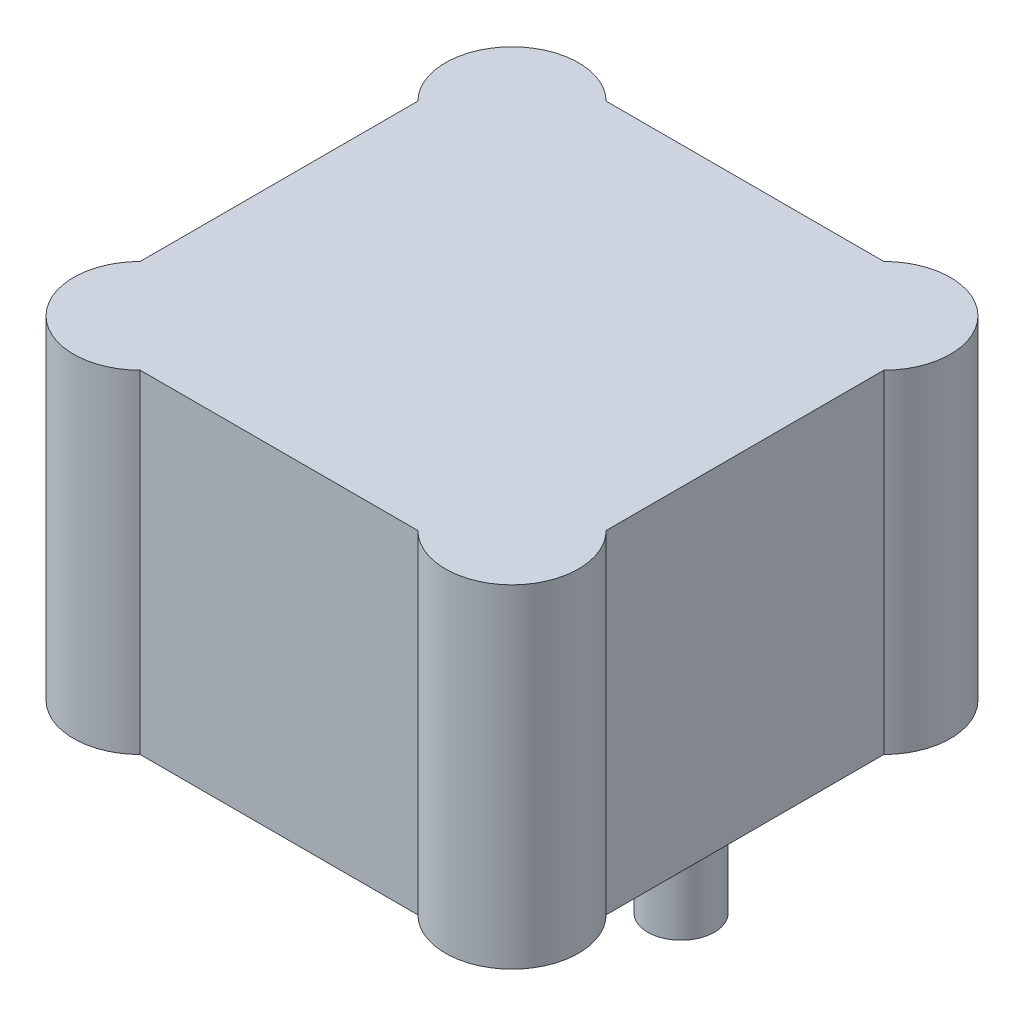
ISO-10303-21;
HEADER;
FILE_DESCRIPTION(('STEP AP214'),'2;1');
FILE_NAME('part.step','',(''),(''),'','','');
FILE_SCHEMA(('AUTOMOTIVE_DESIGN { 1 0 10303 214 1 1 1 1 }'));
ENDSEC;
DATA;
#1=APPLICATION_CONTEXT('core data for automotive mechanical design processes');
#2=APPLICATION_PROTOCOL_DEFINITION('international standard','automotive_design',2000,#1);
#3=PRODUCT_CONTEXT('',#1,'mechanical');
#4=PRODUCT('Part','Part','',(#3));
#5=PRODUCT_RELATED_PRODUCT_CATEGORY('part','',(#4));
#6=PRODUCT_DEFINITION_FORMATION('','',#4);
#7=PRODUCT_DEFINITION_CONTEXT('part definition',#1,'design');
#8=PRODUCT_DEFINITION('design','',#6,#7);
#9=PRODUCT_DEFINITION_SHAPE('','',#8);
#10=(LENGTH_UNIT() NAMED_UNIT(*) SI_UNIT(.MILLI.,.METRE.));
#11=(NAMED_UNIT(*) PLANE_ANGLE_UNIT() SI_UNIT($,.RADIAN.));
#12=(NAMED_UNIT(*) SI_UNIT($,.STERADIAN.) SOLID_ANGLE_UNIT());
#13=UNCERTAINTY_MEASURE_WITH_UNIT(LENGTH_MEASURE(1.E-05),#10,'distance_accuracy_value','');
#14=(GEOMETRIC_REPRESENTATION_CONTEXT(3) GLOBAL_UNCERTAINTY_ASSIGNED_CONTEXT((#13)) GLOBAL_UNIT_ASSIGNED_CONTEXT((#10,
#11,#12)) REPRESENTATION_CONTEXT('',''));
#15=CARTESIAN_POINT('',(0.,0.,0.));
#16=DIRECTION('',(0.,0.,1.));
#17=DIRECTION('',(1.,0.,0.));
#18=AXIS2_PLACEMENT_3D('',#15,#16,#17);
#19=CARTESIAN_POINT('',(-5.58578643762691,10.,-5.58578643762691));
#20=DIRECTION('',(0.,-1.,0.));
#21=DIRECTION('',(0.,0.,-1.));
#22=AXIS2_PLACEMENT_3D('',#19,#20,#21);
#23=CYLINDRICAL_SURFACE('',#22,2.);
#24=CARTESIAN_POINT('',(-5.58578643762691,0.,-5.58578643762691));
#25=DIRECTION('',(0.,1.,0.));
#26=DIRECTION('',(0.,0.,1.));
#27=AXIS2_PLACEMENT_3D('',#24,#25,#26);
#28=CIRCLE('',#27,2.);
#29=CARTESIAN_POINT('',(-4.17157287525381,0.,-7.));
#30=VERTEX_POINT('',#29);
#31=CARTESIAN_POINT('',(-7.,0.,-4.17157287525381));
#32=VERTEX_POINT('',#31);
#33=EDGE_CURVE('E133',#30,#32,#28,.T.);
#34=ORIENTED_EDGE('',*,*,#33,.T.);
#35=DIRECTION('',(0.,-1.,0.));
#36=VECTOR('',#35,1.);
#37=CARTESIAN_POINT('',(-7.,10.,-4.17157287525381));
#38=LINE('',#37,#36);
#39=CARTESIAN_POINT('',(-7.,10.,-4.17157287525381));
#40=VERTEX_POINT('',#39);
#41=EDGE_CURVE('E161',#40,#32,#38,.T.);
#42=ORIENTED_EDGE('',*,*,#41,.F.);
#43=CARTESIAN_POINT('',(-5.58578643762691,10.,-5.58578643762691));
#44=DIRECTION('',(0.,1.,0.));
#45=DIRECTION('',(0.,0.,1.));
#46=AXIS2_PLACEMENT_3D('',#43,#44,#45);
#47=CIRCLE('',#46,2.);
#48=CARTESIAN_POINT('',(-4.17157287525381,10.,-7.));
#49=VERTEX_POINT('',#48);
#50=EDGE_CURVE('E148',#49,#40,#47,.T.);
#51=ORIENTED_EDGE('',*,*,#50,.F.);
#52=DIRECTION('',(0.,-1.,0.));
#53=VECTOR('',#52,1.);
#54=CARTESIAN_POINT('',(-4.17157287525381,10.,-7.));
#55=LINE('',#54,#53);
#56=EDGE_CURVE('E129',#49,#30,#55,.T.);
#57=ORIENTED_EDGE('',*,*,#56,.T.);
#58=EDGE_LOOP('',(#34,#42,#51,#57));
#59=FACE_BOUND('',#58,.T.);
#60=ADVANCED_FACE('F36',(#59),#23,.T.);
#61=CARTESIAN_POINT('',(-7.,10.,4.17157287525381));
#62=DIRECTION('',(1.,0.,0.));
#63=DIRECTION('',(0.,0.,-1.));
#64=AXIS2_PLACEMENT_3D('',#61,#62,#63);
#65=PLANE('',#64);
#66=DIRECTION('',(0.,0.,1.));
#67=VECTOR('',#66,1.);
#68=CARTESIAN_POINT('',(-7.,0.,4.17157287525381));
#69=LINE('',#68,#67);
#70=CARTESIAN_POINT('',(-7.,0.,4.17157287525381));
#71=VERTEX_POINT('',#70);
#72=EDGE_CURVE('E136',#32,#71,#69,.T.);
#73=ORIENTED_EDGE('',*,*,#72,.T.);
#74=DIRECTION('',(0.,-1.,0.));
#75=VECTOR('',#74,1.);
#76=CARTESIAN_POINT('',(-7.,10.,4.17157287525381));
#77=LINE('',#76,#75);
#78=CARTESIAN_POINT('',(-7.,10.,4.17157287525381));
#79=VERTEX_POINT('',#78);
#80=EDGE_CURVE('E158',#79,#71,#77,.T.);
#81=ORIENTED_EDGE('',*,*,#80,.F.);
#82=DIRECTION('',(0.,0.,1.));
#83=VECTOR('',#82,1.);
#84=CARTESIAN_POINT('',(-7.,10.,4.17157287525381));
#85=LINE('',#84,#83);
#86=EDGE_CURVE('E96',#40,#79,#85,.T.);
#87=ORIENTED_EDGE('',*,*,#86,.F.);
#88=ORIENTED_EDGE('',*,*,#41,.T.);
#89=EDGE_LOOP('',(#73,#81,#87,#88));
#90=FACE_BOUND('',#89,.T.);
#91=ADVANCED_FACE('F193',(#90),#65,.F.);
#92=CARTESIAN_POINT('',(-5.58578643762691,10.,5.58578643762691));
#93=DIRECTION('',(0.,-1.,0.));
#94=DIRECTION('',(0.,0.,-1.));
#95=AXIS2_PLACEMENT_3D('',#92,#93,#94);
#96=CYLINDRICAL_SURFACE('',#95,2.);
#97=CARTESIAN_POINT('',(-5.58578643762691,0.,5.58578643762691));
#98=DIRECTION('',(0.,1.,0.));
#99=DIRECTION('',(0.,0.,1.));
#100=AXIS2_PLACEMENT_3D('',#97,#98,#99);
#101=CIRCLE('',#100,2.);
#102=CARTESIAN_POINT('',(-4.17157287525381,0.,7.));
#103=VERTEX_POINT('',#102);
#104=EDGE_CURVE('E139',#71,#103,#101,.T.);
#105=ORIENTED_EDGE('',*,*,#104,.T.);
#106=DIRECTION('',(0.,-1.,0.));
#107=VECTOR('',#106,1.);
#108=CARTESIAN_POINT('',(-4.17157287525381,10.,7.));
#109=LINE('',#108,#107);
#110=CARTESIAN_POINT('',(-4.17157287525381,10.,7.));
#111=VERTEX_POINT('',#110);
#112=EDGE_CURVE('E155',#111,#103,#109,.T.);
#113=ORIENTED_EDGE('',*,*,#112,.F.);
#114=CARTESIAN_POINT('',(-5.58578643762691,10.,5.58578643762691));
#115=DIRECTION('',(0.,1.,0.));
#116=DIRECTION('',(0.,0.,1.));
#117=AXIS2_PLACEMENT_3D('',#114,#115,#116);
#118=CIRCLE('',#117,2.);
#119=EDGE_CURVE('E369',#79,#111,#118,.T.);
#120=ORIENTED_EDGE('',*,*,#119,.F.);
#121=ORIENTED_EDGE('',*,*,#80,.T.);
#122=EDGE_LOOP('',(#105,#113,#120,#121));
#123=FACE_BOUND('',#122,.T.);
#124=ADVANCED_FACE('F197',(#123),#96,.T.);
#125=CARTESIAN_POINT('',(-4.17157287525381,10.,7.));
#126=DIRECTION('',(0.,0.,-1.));
#127=DIRECTION('',(-1.,0.,0.));
#128=AXIS2_PLACEMENT_3D('',#125,#126,#127);
#129=PLANE('',#128);
#130=DIRECTION('',(1.,0.,0.));
#131=VECTOR('',#130,1.);
#132=CARTESIAN_POINT('',(-4.17157287525381,0.,7.));
#133=LINE('',#132,#131);
#134=CARTESIAN_POINT('',(4.17157287525381,0.,7.));
#135=VERTEX_POINT('',#134);
#136=EDGE_CURVE('E141',#103,#135,#133,.T.);
#137=ORIENTED_EDGE('',*,*,#136,.T.);
#138=DIRECTION('',(0.,-1.,0.));
#139=VECTOR('',#138,1.);
#140=CARTESIAN_POINT('',(4.17157287525381,10.,7.));
#141=LINE('',#140,#139);
#142=CARTESIAN_POINT('',(4.17157287525381,10.,7.));
#143=VERTEX_POINT('',#142);
#144=EDGE_CURVE('E152',#143,#135,#141,.T.);
#145=ORIENTED_EDGE('',*,*,#144,.F.);
#146=DIRECTION('',(1.,0.,0.));
#147=VECTOR('',#146,1.);
#148=CARTESIAN_POINT('',(-4.17157287525381,10.,7.));
#149=LINE('',#148,#147);
#150=EDGE_CURVE('E371',#111,#143,#149,.T.);
#151=ORIENTED_EDGE('',*,*,#150,.F.);
#152=ORIENTED_EDGE('',*,*,#112,.T.);
#153=EDGE_LOOP('',(#137,#145,#151,#152));
#154=FACE_BOUND('',#153,.T.);
#155=ADVANCED_FACE('F201',(#154),#129,.F.);
#156=CARTESIAN_POINT('',(5.58578643762691,10.,5.58578643762691));
#157=DIRECTION('',(0.,-1.,0.));
#158=DIRECTION('',(0.,0.,-1.));
#159=AXIS2_PLACEMENT_3D('',#156,#157,#158);
#160=CYLINDRICAL_SURFACE('',#159,2.);
#161=CARTESIAN_POINT('',(5.58578643762691,0.,5.58578643762691));
#162=DIRECTION('',(0.,1.,0.));
#163=DIRECTION('',(0.,0.,1.));
#164=AXIS2_PLACEMENT_3D('',#161,#162,#163);
#165=CIRCLE('',#164,2.);
#166=CARTESIAN_POINT('',(7.,0.,4.17157287525381));
#167=VERTEX_POINT('',#166);
#168=EDGE_CURVE('E143',#135,#167,#165,.T.);
#169=ORIENTED_EDGE('',*,*,#168,.T.);
#170=DIRECTION('',(0.,-1.,0.));
#171=VECTOR('',#170,1.);
#172=CARTESIAN_POINT('',(7.,10.,4.17157287525381));
#173=LINE('',#172,#171);
#174=CARTESIAN_POINT('',(7.,10.,4.17157287525381));
#175=VERTEX_POINT('',#174);
#176=EDGE_CURVE('E124',#175,#167,#173,.T.);
#177=ORIENTED_EDGE('',*,*,#176,.F.);
#178=CARTESIAN_POINT('',(5.58578643762691,10.,5.58578643762691));
#179=DIRECTION('',(0.,1.,0.));
#180=DIRECTION('',(0.,0.,1.));
#181=AXIS2_PLACEMENT_3D('',#178,#179,#180);
#182=CIRCLE('',#181,2.);
#183=EDGE_CURVE('E115',#143,#175,#182,.T.);
#184=ORIENTED_EDGE('',*,*,#183,.F.);
#185=ORIENTED_EDGE('',*,*,#144,.T.);
#186=EDGE_LOOP('',(#169,#177,#184,#185));
#187=FACE_BOUND('',#186,.T.);
#188=ADVANCED_FACE('F207',(#187),#160,.T.);
#189=CARTESIAN_POINT('',(7.,10.,4.17157287525381));
#190=DIRECTION('',(-1.,0.,0.));
#191=DIRECTION('',(0.,0.,1.));
#192=AXIS2_PLACEMENT_3D('',#189,#190,#191);
#193=PLANE('',#192);
#194=DIRECTION('',(0.,0.,-1.));
#195=VECTOR('',#194,1.);
#196=CARTESIAN_POINT('',(7.,0.,4.17157287525381));
#197=LINE('',#196,#195);
#198=CARTESIAN_POINT('',(7.,0.,-4.17157287525381));
#199=VERTEX_POINT('',#198);
#200=EDGE_CURVE('E123',#167,#199,#197,.T.);
#201=ORIENTED_EDGE('',*,*,#200,.T.);
#202=DIRECTION('',(0.,-1.,0.));
#203=VECTOR('',#202,1.);
#204=CARTESIAN_POINT('',(7.,10.,-4.17157287525381));
#205=LINE('',#204,#203);
#206=CARTESIAN_POINT('',(7.,10.,-4.17157287525381));
#207=VERTEX_POINT('',#206);
#208=EDGE_CURVE('E120',#207,#199,#205,.T.);
#209=ORIENTED_EDGE('',*,*,#208,.F.);
#210=DIRECTION('',(0.,0.,-1.));
#211=VECTOR('',#210,1.);
#212=CARTESIAN_POINT('',(7.,10.,4.17157287525381));
#213=LINE('',#212,#211);
#214=EDGE_CURVE('E109',#175,#207,#213,.T.);
#215=ORIENTED_EDGE('',*,*,#214,.F.);
#216=ORIENTED_EDGE('',*,*,#176,.T.);
#217=EDGE_LOOP('',(#201,#209,#215,#216));
#218=FACE_BOUND('',#217,.T.);
#219=ADVANCED_FACE('F121',(#218),#193,.F.);
#220=CARTESIAN_POINT('',(5.58578643762691,10.,-5.58578643762691));
#221=DIRECTION('',(0.,-1.,0.));
#222=DIRECTION('',(0.,0.,-1.));
#223=AXIS2_PLACEMENT_3D('',#220,#221,#222);
#224=CYLINDRICAL_SURFACE('',#223,2.);
#225=CARTESIAN_POINT('',(5.58578643762691,0.,-5.58578643762691));
#226=DIRECTION('',(0.,1.,0.));
#227=DIRECTION('',(0.,0.,1.));
#228=AXIS2_PLACEMENT_3D('',#225,#226,#227);
#229=CIRCLE('',#228,2.);
#230=CARTESIAN_POINT('',(4.17157287525381,0.,-7.));
#231=VERTEX_POINT('',#230);
#232=EDGE_CURVE('E81',#199,#231,#229,.T.);
#233=ORIENTED_EDGE('',*,*,#232,.T.);
#234=DIRECTION('',(0.,-1.,0.));
#235=VECTOR('',#234,1.);
#236=CARTESIAN_POINT('',(4.17157287525381,10.,-7.));
#237=LINE('',#236,#235);
#238=CARTESIAN_POINT('',(4.17157287525381,10.,-7.));
#239=VERTEX_POINT('',#238);
#240=EDGE_CURVE('E125',#239,#231,#237,.T.);
#241=ORIENTED_EDGE('',*,*,#240,.F.);
#242=CARTESIAN_POINT('',(5.58578643762691,10.,-5.58578643762691));
#243=DIRECTION('',(0.,1.,0.));
#244=DIRECTION('',(0.,0.,1.));
#245=AXIS2_PLACEMENT_3D('',#242,#243,#244);
#246=CIRCLE('',#245,2.);
#247=EDGE_CURVE('E113',#207,#239,#246,.T.);
#248=ORIENTED_EDGE('',*,*,#247,.F.);
#249=ORIENTED_EDGE('',*,*,#208,.T.);
#250=EDGE_LOOP('',(#233,#241,#248,#249));
#251=FACE_BOUND('',#250,.T.);
#252=ADVANCED_FACE('F127',(#251),#224,.T.);
#253=CARTESIAN_POINT('',(-4.17157287525381,10.,-7.));
#254=DIRECTION('',(0.,0.,1.));
#255=DIRECTION('',(1.,0.,0.));
#256=AXIS2_PLACEMENT_3D('',#253,#254,#255);
#257=PLANE('',#256);
#258=DIRECTION('',(-1.,0.,0.));
#259=VECTOR('',#258,1.);
#260=CARTESIAN_POINT('',(-4.17157287525381,0.,-7.));
#261=LINE('',#260,#259);
#262=EDGE_CURVE('E87',#231,#30,#261,.T.);
#263=ORIENTED_EDGE('',*,*,#262,.T.);
#264=ORIENTED_EDGE('',*,*,#56,.F.);
#265=DIRECTION('',(-1.,0.,0.));
#266=VECTOR('',#265,1.);
#267=CARTESIAN_POINT('',(-4.17157287525381,10.,-7.));
#268=LINE('',#267,#266);
#269=EDGE_CURVE('E52',#239,#49,#268,.T.);
#270=ORIENTED_EDGE('',*,*,#269,.F.);
#271=ORIENTED_EDGE('',*,*,#240,.T.);
#272=EDGE_LOOP('',(#263,#264,#270,#271));
#273=FACE_BOUND('',#272,.T.);
#274=ADVANCED_FACE('F183',(#273),#257,.F.);
#275=CARTESIAN_POINT('',(-5.58578643762691,10.,-5.58578643762691));
#276=DIRECTION('',(0.,1.,0.));
#277=DIRECTION('',(0.,0.,1.));
#278=AXIS2_PLACEMENT_3D('',#275,#276,#277);
#279=PLANE('',#278);
#280=ORIENTED_EDGE('',*,*,#50,.T.);
#281=ORIENTED_EDGE('',*,*,#86,.T.);
#282=ORIENTED_EDGE('',*,*,#119,.T.);
#283=ORIENTED_EDGE('',*,*,#150,.T.);
#284=ORIENTED_EDGE('',*,*,#183,.T.);
#285=ORIENTED_EDGE('',*,*,#214,.T.);
#286=ORIENTED_EDGE('',*,*,#247,.T.);
#287=ORIENTED_EDGE('',*,*,#269,.T.);
#288=EDGE_LOOP('',(#280,#281,#282,#283,#284,#285,#286,#287));
#289=FACE_BOUND('',#288,.T.);
#290=ADVANCED_FACE('F111',(#289),#279,.T.);
#291=CARTESIAN_POINT('',(-5.58578643762691,0.,-5.58578643762691));
#292=DIRECTION('',(0.,1.,0.));
#293=DIRECTION('',(0.,0.,1.));
#294=AXIS2_PLACEMENT_3D('',#291,#292,#293);
#295=PLANE('',#294);
#296=CARTESIAN_POINT('',(5.08,0.,0.));
#297=DIRECTION('',(0.,1.,0.));
#298=DIRECTION('',(0.,0.,1.));
#299=AXIS2_PLACEMENT_3D('',#296,#297,#298);
#300=CIRCLE('',#299,1.);
#301=CARTESIAN_POINT('',(5.08,0.,1.));
#302=VERTEX_POINT('',#301);
#303=EDGE_CURVE('E11',#302,#302,#300,.F.);
#304=ORIENTED_EDGE('',*,*,#303,.F.);
#305=EDGE_LOOP('',(#304));
#306=FACE_BOUND('',#305,.T.);
#307=CARTESIAN_POINT('',(-5.08,0.,0.));
#308=DIRECTION('',(0.,1.,0.));
#309=DIRECTION('',(0.,0.,1.));
#310=AXIS2_PLACEMENT_3D('',#307,#308,#309);
#311=CIRCLE('',#310,1.);
#312=CARTESIAN_POINT('',(-5.08,0.,1.));
#313=VERTEX_POINT('',#312);
#314=EDGE_CURVE('E44',#313,#313,#311,.F.);
#315=ORIENTED_EDGE('',*,*,#314,.F.);
#316=EDGE_LOOP('',(#315));
#317=FACE_BOUND('',#316,.T.);
#318=CARTESIAN_POINT('',(0.,0.,0.));
#319=DIRECTION('',(0.,1.,0.));
#320=DIRECTION('',(0.,0.,1.));
#321=AXIS2_PLACEMENT_3D('',#318,#319,#320);
#322=CIRCLE('',#321,2.);
#323=CARTESIAN_POINT('',(0.,0.,2.));
#324=VERTEX_POINT('',#323);
#325=EDGE_CURVE('E163',#324,#324,#322,.F.);
#326=ORIENTED_EDGE('',*,*,#325,.F.);
#327=EDGE_LOOP('',(#326));
#328=FACE_BOUND('',#327,.T.);
#329=ORIENTED_EDGE('',*,*,#33,.F.);
#330=ORIENTED_EDGE('',*,*,#262,.F.);
#331=ORIENTED_EDGE('',*,*,#232,.F.);
#332=ORIENTED_EDGE('',*,*,#200,.F.);
#333=ORIENTED_EDGE('',*,*,#168,.F.);
#334=ORIENTED_EDGE('',*,*,#136,.F.);
#335=ORIENTED_EDGE('',*,*,#104,.F.);
#336=ORIENTED_EDGE('',*,*,#72,.F.);
#337=EDGE_LOOP('',(#329,#330,#331,#332,#333,#334,#335,#336));
#338=FACE_BOUND('',#337,.T.);
#339=ADVANCED_FACE('F170',(#306,#317,#328,#338),#295,.F.);
#340=CARTESIAN_POINT('',(0.,-3.,0.));
#341=DIRECTION('',(0.,1.,0.));
#342=DIRECTION('',(0.,0.,1.));
#343=AXIS2_PLACEMENT_3D('',#340,#341,#342);
#344=CYLINDRICAL_SURFACE('',#343,2.);
#345=CARTESIAN_POINT('',(0.,-3.,0.));
#346=DIRECTION('',(0.,-1.,0.));
#347=DIRECTION('',(0.,0.,-1.));
#348=AXIS2_PLACEMENT_3D('',#345,#346,#347);
#349=CIRCLE('',#348,2.);
#350=CARTESIAN_POINT('',(0.,-3.,-2.));
#351=VERTEX_POINT('',#350);
#352=EDGE_CURVE('E137',#351,#351,#349,.T.);
#353=ORIENTED_EDGE('',*,*,#352,.F.);
#354=EDGE_LOOP('',(#353));
#355=FACE_BOUND('',#354,.T.);
#356=ORIENTED_EDGE('',*,*,#325,.T.);
#357=EDGE_LOOP('',(#356));
#358=FACE_BOUND('',#357,.T.);
#359=ADVANCED_FACE('F173',(#355,#358),#344,.T.);
#360=CARTESIAN_POINT('',(0.,-3.,0.));
#361=DIRECTION('',(0.,-1.,0.));
#362=DIRECTION('',(0.,0.,-1.));
#363=AXIS2_PLACEMENT_3D('',#360,#361,#362);
#364=PLANE('',#363);
#365=ORIENTED_EDGE('',*,*,#352,.T.);
#366=EDGE_LOOP('',(#365));
#367=FACE_BOUND('',#366,.T.);
#368=ADVANCED_FACE('F250',(#367),#364,.T.);
#369=CARTESIAN_POINT('',(-5.08,-3.,0.));
#370=DIRECTION('',(0.,1.,0.));
#371=DIRECTION('',(0.,0.,1.));
#372=AXIS2_PLACEMENT_3D('',#369,#370,#371);
#373=CYLINDRICAL_SURFACE('',#372,1.);
#374=CARTESIAN_POINT('',(-5.08,-3.,0.));
#375=DIRECTION('',(0.,-1.,0.));
#376=DIRECTION('',(0.,0.,-1.));
#377=AXIS2_PLACEMENT_3D('',#374,#375,#376);
#378=CIRCLE('',#377,1.);
#379=CARTESIAN_POINT('',(-5.08,-3.,-1.));
#380=VERTEX_POINT('',#379);
#381=EDGE_CURVE('E360',#380,#380,#378,.T.);
#382=ORIENTED_EDGE('',*,*,#381,.F.);
#383=EDGE_LOOP('',(#382));
#384=FACE_BOUND('',#383,.T.);
#385=ORIENTED_EDGE('',*,*,#314,.T.);
#386=EDGE_LOOP('',(#385));
#387=FACE_BOUND('',#386,.T.);
#388=ADVANCED_FACE('F168',(#384,#387),#373,.T.);
#389=CARTESIAN_POINT('',(-5.08,-3.,0.));
#390=DIRECTION('',(0.,-1.,0.));
#391=DIRECTION('',(0.,0.,-1.));
#392=AXIS2_PLACEMENT_3D('',#389,#390,#391);
#393=PLANE('',#392);
#394=ORIENTED_EDGE('',*,*,#381,.T.);
#395=EDGE_LOOP('',(#394));
#396=FACE_BOUND('',#395,.T.);
#397=ADVANCED_FACE('F271',(#396),#393,.T.);
#398=CARTESIAN_POINT('',(5.08,-3.,0.));
#399=DIRECTION('',(0.,1.,0.));
#400=DIRECTION('',(0.,0.,1.));
#401=AXIS2_PLACEMENT_3D('',#398,#399,#400);
#402=CYLINDRICAL_SURFACE('',#401,1.);
#403=CARTESIAN_POINT('',(5.08,-3.,0.));
#404=DIRECTION('',(0.,-1.,0.));
#405=DIRECTION('',(0.,0.,-1.));
#406=AXIS2_PLACEMENT_3D('',#403,#404,#405);
#407=CIRCLE('',#406,1.);
#408=CARTESIAN_POINT('',(5.08,-3.,-1.));
#409=VERTEX_POINT('',#408);
#410=EDGE_CURVE('E359',#409,#409,#407,.T.);
#411=ORIENTED_EDGE('',*,*,#410,.F.);
#412=EDGE_LOOP('',(#411));
#413=FACE_BOUND('',#412,.T.);
#414=ORIENTED_EDGE('',*,*,#303,.T.);
#415=EDGE_LOOP('',(#414));
#416=FACE_BOUND('',#415,.T.);
#417=ADVANCED_FACE('F282',(#413,#416),#402,.T.);
#418=CARTESIAN_POINT('',(5.08,-3.,0.));
#419=DIRECTION('',(0.,-1.,0.));
#420=DIRECTION('',(0.,0.,-1.));
#421=AXIS2_PLACEMENT_3D('',#418,#419,#420);
#422=PLANE('',#421);
#423=ORIENTED_EDGE('',*,*,#410,.T.);
#424=EDGE_LOOP('',(#423));
#425=FACE_BOUND('',#424,.T.);
#426=ADVANCED_FACE('F293',(#425),#422,.T.);
#427=CLOSED_SHELL('',(#60,#91,#124,#155,#188,#219,#252,#274,#290,#339,#359,#368,#388,#397,#417,#426));
#428=MANIFOLD_SOLID_BREP('B2',#427);
#429=ADVANCED_BREP_SHAPE_REPRESENTATION('',(#18,#428),#14);
#430=SHAPE_DEFINITION_REPRESENTATION(#9,#429);
ENDSEC;
END-ISO-10303-21;
